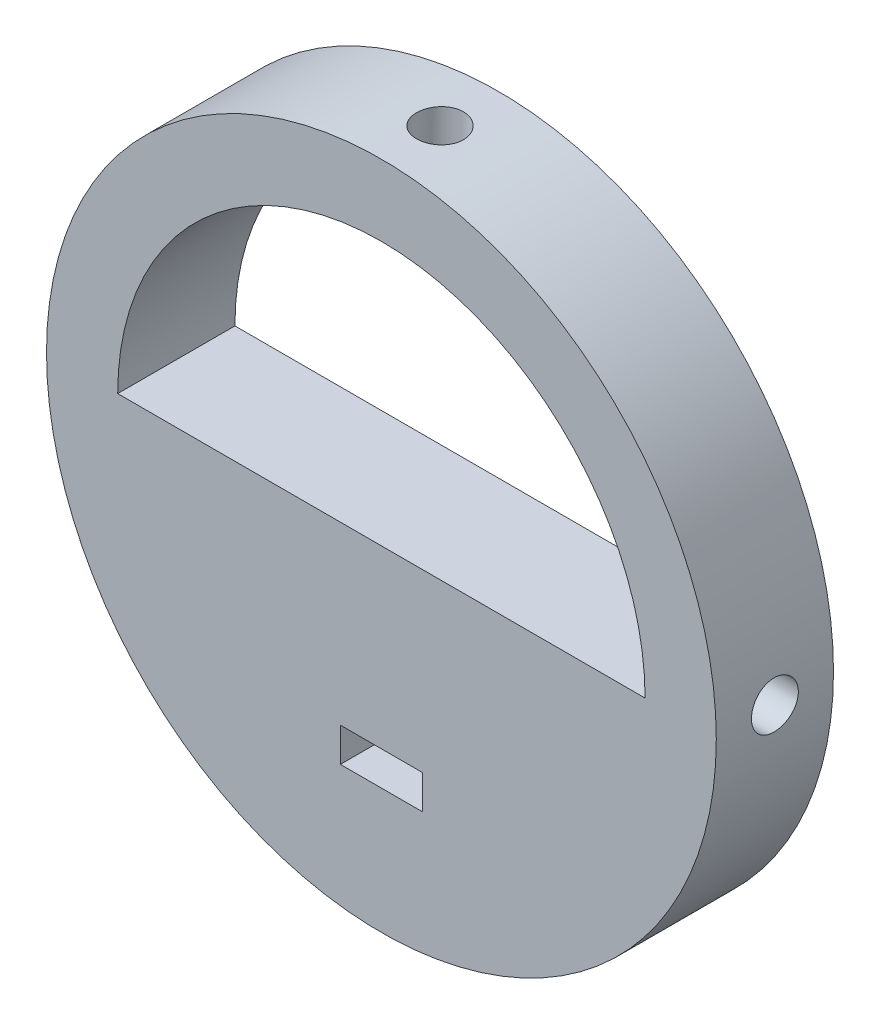
ISO-10303-21;
HEADER;
FILE_DESCRIPTION(('STEP AP214'),'2;1');
FILE_NAME('part.step','',(''),(''),'','','');
FILE_SCHEMA(('AUTOMOTIVE_DESIGN { 1 0 10303 214 1 1 1 1 }'));
ENDSEC;
DATA;
#1=APPLICATION_CONTEXT('core data for automotive mechanical design processes');
#2=APPLICATION_PROTOCOL_DEFINITION('international standard','automotive_design',2000,#1);
#3=PRODUCT_CONTEXT('',#1,'mechanical');
#4=PRODUCT('Part','Part','',(#3));
#5=PRODUCT_RELATED_PRODUCT_CATEGORY('part','',(#4));
#6=PRODUCT_DEFINITION_FORMATION('','',#4);
#7=PRODUCT_DEFINITION_CONTEXT('part definition',#1,'design');
#8=PRODUCT_DEFINITION('design','',#6,#7);
#9=PRODUCT_DEFINITION_SHAPE('','',#8);
#10=(LENGTH_UNIT() NAMED_UNIT(*) SI_UNIT(.MILLI.,.METRE.));
#11=(NAMED_UNIT(*) PLANE_ANGLE_UNIT() SI_UNIT($,.RADIAN.));
#12=(NAMED_UNIT(*) SI_UNIT($,.STERADIAN.) SOLID_ANGLE_UNIT());
#13=UNCERTAINTY_MEASURE_WITH_UNIT(LENGTH_MEASURE(1.E-05),#10,'distance_accuracy_value','');
#14=(GEOMETRIC_REPRESENTATION_CONTEXT(3) GLOBAL_UNCERTAINTY_ASSIGNED_CONTEXT((#13)) GLOBAL_UNIT_ASSIGNED_CONTEXT((#10,
#11,#12)) REPRESENTATION_CONTEXT('',''));
#15=CARTESIAN_POINT('',(0.,0.,0.));
#16=DIRECTION('',(0.,0.,1.));
#17=DIRECTION('',(1.,0.,0.));
#18=AXIS2_PLACEMENT_3D('',#15,#16,#17);
#19=CARTESIAN_POINT('',(3.5,-17.9,-2.02072594216369));
#20=DIRECTION('',(0.5,0.,-0.866025403784439));
#21=DIRECTION('',(-0.866025403784439,0.,-0.5));
#22=AXIS2_PLACEMENT_3D('',#19,#20,#21);
#23=PLANE('',#22);
#24=DIRECTION('',(-0.866025403784438,0.,-0.5));
#25=VECTOR('',#24,1.);
#26=CARTESIAN_POINT('',(3.5,-15.,-2.02072594216369));
#27=LINE('',#26,#25);
#28=CARTESIAN_POINT('',(3.5,-15.,-2.02072594216369));
#29=VERTEX_POINT('',#28);
#30=CARTESIAN_POINT('',(0.,-15.,-4.04145188432738));
#31=VERTEX_POINT('',#30);
#32=EDGE_CURVE('E144',#29,#31,#27,.T.);
#33=ORIENTED_EDGE('',*,*,#32,.T.);
#34=DIRECTION('',(0.,1.,0.));
#35=VECTOR('',#34,1.);
#36=CARTESIAN_POINT('',(0.,-17.9,-4.04145188432738));
#37=LINE('',#36,#35);
#38=CARTESIAN_POINT('',(0.,-17.9,-4.04145188432738));
#39=VERTEX_POINT('',#38);
#40=EDGE_CURVE('E157',#39,#31,#37,.T.);
#41=ORIENTED_EDGE('',*,*,#40,.F.);
#42=DIRECTION('',(-0.866025403784438,0.,-0.5));
#43=VECTOR('',#42,1.);
#44=CARTESIAN_POINT('',(3.5,-17.9,-2.02072594216369));
#45=LINE('',#44,#43);
#46=CARTESIAN_POINT('',(3.5,-17.9,-2.02072594216369));
#47=VERTEX_POINT('',#46);
#48=EDGE_CURVE('E147',#47,#39,#45,.T.);
#49=ORIENTED_EDGE('',*,*,#48,.F.);
#50=DIRECTION('',(0.,1.,0.));
#51=VECTOR('',#50,1.);
#52=CARTESIAN_POINT('',(3.5,-17.9,-2.02072594216369));
#53=LINE('',#52,#51);
#54=EDGE_CURVE('E162',#47,#29,#53,.T.);
#55=ORIENTED_EDGE('',*,*,#54,.T.);
#56=EDGE_LOOP('',(#33,#41,#49,#55));
#57=FACE_BOUND('',#56,.T.);
#58=ADVANCED_FACE('F37',(#57),#23,.F.);
#59=CARTESIAN_POINT('',(3.5,-17.9,2.02072594216369));
#60=DIRECTION('',(1.,0.,0.));
#61=DIRECTION('',(0.,0.,-1.));
#62=AXIS2_PLACEMENT_3D('',#59,#60,#61);
#63=PLANE('',#62);
#64=DIRECTION('',(0.,0.,-1.));
#65=VECTOR('',#64,1.);
#66=CARTESIAN_POINT('',(3.5,-15.,2.02072594216369));
#67=LINE('',#66,#65);
#68=CARTESIAN_POINT('',(3.5,-15.,5.));
#69=VERTEX_POINT('',#68);
#70=EDGE_CURVE('E57',#69,#29,#67,.T.);
#71=ORIENTED_EDGE('',*,*,#70,.T.);
#72=ORIENTED_EDGE('',*,*,#54,.F.);
#73=DIRECTION('',(0.,0.,-1.));
#74=VECTOR('',#73,1.);
#75=CARTESIAN_POINT('',(3.5,-17.9,2.02072594216369));
#76=LINE('',#75,#74);
#77=CARTESIAN_POINT('',(3.5,-17.9,5.));
#78=VERTEX_POINT('',#77);
#79=EDGE_CURVE('E155',#78,#47,#76,.T.);
#80=ORIENTED_EDGE('',*,*,#79,.F.);
#81=DIRECTION('',(0.,1.,0.));
#82=VECTOR('',#81,1.);
#83=CARTESIAN_POINT('',(3.5,-15.,5.));
#84=LINE('',#83,#82);
#85=EDGE_CURVE('E118',#78,#69,#84,.T.);
#86=ORIENTED_EDGE('',*,*,#85,.T.);
#87=EDGE_LOOP('',(#71,#72,#80,#86));
#88=FACE_BOUND('',#87,.T.);
#89=ADVANCED_FACE('F207',(#88),#63,.F.);
#90=CARTESIAN_POINT('',(-3.5,-17.9,-2.02072594216369));
#91=DIRECTION('',(-1.,0.,0.));
#92=DIRECTION('',(0.,0.,1.));
#93=AXIS2_PLACEMENT_3D('',#90,#91,#92);
#94=PLANE('',#93);
#95=DIRECTION('',(0.,-1.,0.));
#96=VECTOR('',#95,1.);
#97=CARTESIAN_POINT('',(-3.5,-15.,5.));
#98=LINE('',#97,#96);
#99=CARTESIAN_POINT('',(-3.5,-15.,5.));
#100=VERTEX_POINT('',#99);
#101=CARTESIAN_POINT('',(-3.5,-17.9,5.));
#102=VERTEX_POINT('',#101);
#103=EDGE_CURVE('E106',#100,#102,#98,.T.);
#104=ORIENTED_EDGE('',*,*,#103,.T.);
#105=DIRECTION('',(0.,0.,1.));
#106=VECTOR('',#105,1.);
#107=CARTESIAN_POINT('',(-3.5,-17.9,-2.02072594216369));
#108=LINE('',#107,#106);
#109=CARTESIAN_POINT('',(-3.5,-17.9,-2.02072594216369));
#110=VERTEX_POINT('',#109);
#111=EDGE_CURVE('E153',#110,#102,#108,.T.);
#112=ORIENTED_EDGE('',*,*,#111,.F.);
#113=DIRECTION('',(0.,1.,0.));
#114=VECTOR('',#113,1.);
#115=CARTESIAN_POINT('',(-3.5,-17.9,-2.02072594216369));
#116=LINE('',#115,#114);
#117=CARTESIAN_POINT('',(-3.5,-15.,-2.02072594216369));
#118=VERTEX_POINT('',#117);
#119=EDGE_CURVE('E108',#110,#118,#116,.T.);
#120=ORIENTED_EDGE('',*,*,#119,.T.);
#121=DIRECTION('',(0.,0.,1.));
#122=VECTOR('',#121,1.);
#123=CARTESIAN_POINT('',(-3.5,-15.,-2.02072594216369));
#124=LINE('',#123,#122);
#125=EDGE_CURVE('E102',#118,#100,#124,.T.);
#126=ORIENTED_EDGE('',*,*,#125,.T.);
#127=EDGE_LOOP('',(#104,#112,#120,#126));
#128=FACE_BOUND('',#127,.T.);
#129=ADVANCED_FACE('F103',(#128),#94,.F.);
#130=CARTESIAN_POINT('',(0.,-17.9,-4.04145188432738));
#131=DIRECTION('',(-0.5,0.,-0.866025403784439));
#132=DIRECTION('',(-0.866025403784439,0.,0.5));
#133=AXIS2_PLACEMENT_3D('',#130,#131,#132);
#134=PLANE('',#133);
#135=DIRECTION('',(-0.866025403784438,0.,0.5));
#136=VECTOR('',#135,1.);
#137=CARTESIAN_POINT('',(0.,-15.,-4.04145188432738));
#138=LINE('',#137,#136);
#139=EDGE_CURVE('E111',#31,#118,#138,.T.);
#140=ORIENTED_EDGE('',*,*,#139,.T.);
#141=ORIENTED_EDGE('',*,*,#119,.F.);
#142=DIRECTION('',(-0.866025403784438,0.,0.5));
#143=VECTOR('',#142,1.);
#144=CARTESIAN_POINT('',(0.,-17.9,-4.04145188432738));
#145=LINE('',#144,#143);
#146=EDGE_CURVE('E150',#39,#110,#145,.T.);
#147=ORIENTED_EDGE('',*,*,#146,.F.);
#148=ORIENTED_EDGE('',*,*,#40,.T.);
#149=EDGE_LOOP('',(#140,#141,#147,#148));
#150=FACE_BOUND('',#149,.T.);
#151=ADVANCED_FACE('F217',(#150),#134,.F.);
#152=CARTESIAN_POINT('',(0.,-17.9,0.));
#153=DIRECTION('',(0.,1.,0.));
#154=DIRECTION('',(0.,0.,1.));
#155=AXIS2_PLACEMENT_3D('',#152,#153,#154);
#156=PLANE('',#155);
#157=CARTESIAN_POINT('',(0.,-17.9,0.));
#158=DIRECTION('',(0.,1.,0.));
#159=DIRECTION('',(0.,0.,1.));
#160=AXIS2_PLACEMENT_3D('',#157,#158,#159);
#161=CIRCLE('',#160,2.);
#162=CARTESIAN_POINT('',(0.,-17.9,2.));
#163=VERTEX_POINT('',#162);
#164=EDGE_CURVE('E434',#163,#163,#161,.T.);
#165=ORIENTED_EDGE('',*,*,#164,.F.);
#166=EDGE_LOOP('',(#165));
#167=FACE_BOUND('',#166,.T.);
#168=DIRECTION('',(1.,0.,0.));
#169=VECTOR('',#168,1.);
#170=CARTESIAN_POINT('',(-3.5,-17.9,5.));
#171=LINE('',#170,#169);
#172=EDGE_CURVE('E123',#102,#78,#171,.T.);
#173=ORIENTED_EDGE('',*,*,#172,.T.);
#174=ORIENTED_EDGE('',*,*,#79,.T.);
#175=ORIENTED_EDGE('',*,*,#48,.T.);
#176=ORIENTED_EDGE('',*,*,#146,.T.);
#177=ORIENTED_EDGE('',*,*,#111,.T.);
#178=EDGE_LOOP('',(#173,#174,#175,#176,#177));
#179=FACE_BOUND('',#178,.T.);
#180=ADVANCED_FACE('F260',(#167,#179),#156,.T.);
#181=CARTESIAN_POINT('',(0.,-15.,0.));
#182=DIRECTION('',(0.,1.,0.));
#183=DIRECTION('',(0.,0.,1.));
#184=AXIS2_PLACEMENT_3D('',#181,#182,#183);
#185=PLANE('',#184);
#186=ORIENTED_EDGE('',*,*,#70,.F.);
#187=DIRECTION('',(-1.,0.,0.));
#188=VECTOR('',#187,1.);
#189=CARTESIAN_POINT('',(-3.5,-15.,5.));
#190=LINE('',#189,#188);
#191=EDGE_CURVE('E114',#69,#100,#190,.T.);
#192=ORIENTED_EDGE('',*,*,#191,.T.);
#193=ORIENTED_EDGE('',*,*,#125,.F.);
#194=ORIENTED_EDGE('',*,*,#139,.F.);
#195=ORIENTED_EDGE('',*,*,#32,.F.);
#196=EDGE_LOOP('',(#186,#192,#193,#194,#195));
#197=FACE_BOUND('',#196,.T.);
#198=ADVANCED_FACE('F115',(#197),#185,.F.);
#199=CARTESIAN_POINT('',(0.,0.,-5.));
#200=DIRECTION('',(0.,0.,1.));
#201=DIRECTION('',(1.,0.,0.));
#202=AXIS2_PLACEMENT_3D('',#199,#200,#201);
#203=CYLINDRICAL_SURFACE('',#202,28.575);
#204=CARTESIAN_POINT('',(0.,-28.575,2.));
#205=CARTESIAN_POINT('',(-0.11219354056318,-28.5749990738678,1.99999507471177));
#206=CARTESIAN_POINT('',(-0.224464926653708,-28.5743321854995,1.99052772333908));
#207=CARTESIAN_POINT('',(-0.445905587141128,-28.5717359509591,1.95289761788403));
#208=CARTESIAN_POINT('',(-0.55507113061016,-28.569805148207,1.92471329315176));
#209=CARTESIAN_POINT('',(-0.767060613861274,-28.5648994336108,1.85046453837661));
#210=CARTESIAN_POINT('',(-0.869887943811847,-28.5619250857343,1.80440976471592));
#211=CARTESIAN_POINT('',(-1.06632644044454,-28.5552664930909,1.69574364018007));
#212=CARTESIAN_POINT('',(-1.15993966570778,-28.5515824074374,1.63313599905981));
#213=CARTESIAN_POINT('',(-1.33549115752078,-28.5439106289807,1.49301579467679));
#214=CARTESIAN_POINT('',(-1.41741017111496,-28.5399224517177,1.41547913457492));
#215=CARTESIAN_POINT('',(-1.56708298415313,-28.5320960917165,1.24775209950961));
#216=CARTESIAN_POINT('',(-1.63483618201317,-28.5282579153541,1.15756118742593));
#217=CARTESIAN_POINT('',(-1.75431592485464,-28.5211605569518,0.966973587270234));
#218=CARTESIAN_POINT('',(-1.80602608287604,-28.5179019683642,0.86656660218511));
#219=CARTESIAN_POINT('',(-1.89184711406326,-28.5123376754792,0.658469075878694));
#220=CARTESIAN_POINT('',(-1.92595821603923,-28.5100319587932,0.550778629372273));
#221=CARTESIAN_POINT('',(-1.97555837686609,-28.5066381321122,0.331359857468293));
#222=CARTESIAN_POINT('',(-1.99107812480204,-28.50554801571,0.219638500951531));
#223=CARTESIAN_POINT('',(-2.00314979096334,-28.5047023203391,-0.00482845246959328));
#224=CARTESIAN_POINT('',(-1.99970197005855,-28.5049467230162,-0.117574035266001));
#225=CARTESIAN_POINT('',(-1.9739617964128,-28.5067406426929,-0.340679507299212));
#226=CARTESIAN_POINT('',(-1.95170269856514,-28.5082878565433,-0.451043254323602));
#227=CARTESIAN_POINT('',(-1.88902343427751,-28.512509426471,-0.666464138270835));
#228=CARTESIAN_POINT('',(-1.84860313651441,-28.5151837906987,-0.771521236815336));
#229=CARTESIAN_POINT('',(-1.75071127246671,-28.5213609483183,-0.973453202932212));
#230=CARTESIAN_POINT('',(-1.6932246748445,-28.5248644714474,-1.07032076043874));
#231=CARTESIAN_POINT('',(-1.56284291542426,-28.5323044371043,-1.25304400808392));
#232=CARTESIAN_POINT('',(-1.48994753497078,-28.5362408857752,-1.33889954193074));
#233=CARTESIAN_POINT('',(-1.3306304004101,-28.5441133534399,-1.49735506013894));
#234=CARTESIAN_POINT('',(-1.24417987653217,-28.5480493532807,-1.5699261223949));
#235=CARTESIAN_POINT('',(-1.06030716399757,-28.5554692728602,-1.6995294102635));
#236=CARTESIAN_POINT('',(-0.962884970522834,-28.5589531924004,-1.75656162905242));
#237=CARTESIAN_POINT('',(-0.759816421663919,-28.5650767767097,-1.85346605967542));
#238=CARTESIAN_POINT('',(-0.654169512785724,-28.5677163845986,-1.89333711544357));
#239=CARTESIAN_POINT('',(-0.437658553002704,-28.5718531926787,-1.95476780448379));
#240=CARTESIAN_POINT('',(-0.326794578505564,-28.5733504095954,-1.97632770584786));
#241=CARTESIAN_POINT('',(-0.103247364094242,-28.5750315797095,-2.0004881037716));
#242=CARTESIAN_POINT('',(0.00943153552587676,-28.5752183018364,-2.00312857522494));
#243=CARTESIAN_POINT('',(0.233630561696571,-28.5742648175843,-1.9894796971824));
#244=CARTESIAN_POINT('',(0.345150695829088,-28.5731246198931,-1.9731904716246));
#245=CARTESIAN_POINT('',(0.563753485923264,-28.5696473918489,-1.92217770100428));
#246=CARTESIAN_POINT('',(0.670840456793627,-28.5673115563252,-1.8874725581378));
#247=CARTESIAN_POINT('',(0.877670453192774,-28.5617057113006,-1.80063182781188));
#248=CARTESIAN_POINT('',(0.977413396102877,-28.5584356912925,-1.74849604429816));
#249=CARTESIAN_POINT('',(1.16690669015187,-28.5513217187838,-1.62817263987901));
#250=CARTESIAN_POINT('',(1.25664009705187,-28.5474768181116,-1.55995839096376));
#251=CARTESIAN_POINT('',(1.42339639101104,-28.5396487395034,-1.40945306968943));
#252=CARTESIAN_POINT('',(1.50041912186126,-28.5356655598688,-1.3271618243552));
#253=CARTESIAN_POINT('',(1.63970364658386,-28.5280017693994,-1.15066565883352));
#254=CARTESIAN_POINT('',(1.70193945657758,-28.5243216984972,-1.05644020643188));
#255=CARTESIAN_POINT('',(1.80970562174227,-28.5176878107967,-0.858853202922395));
#256=CARTESIAN_POINT('',(1.85523610102576,-28.5147339886028,-0.755491719697911));
#257=CARTESIAN_POINT('',(1.92825440331169,-28.5098896365248,-0.542660665084102));
#258=CARTESIAN_POINT('',(1.95575843360493,-28.5079981517297,-0.433196676722416));
#259=CARTESIAN_POINT('',(1.99199597890018,-28.5054891571507,-0.211190705646622));
#260=CARTESIAN_POINT('',(2.0007297368058,-28.5048716308807,-0.0986487627830022));
#261=CARTESIAN_POINT('',(1.99917634609933,-28.5049805995046,0.1260601712499));
#262=CARTESIAN_POINT('',(1.98893003786454,-28.505704208611,0.23822744842165));
#263=CARTESIAN_POINT('',(1.9497922053696,-28.508407791037,0.459244479797018));
#264=CARTESIAN_POINT('',(1.92090064884107,-28.510387766531,0.568094228258817));
#265=CARTESIAN_POINT('',(1.84530205889283,-28.51538024377,0.779391268602113));
#266=CARTESIAN_POINT('',(1.7985953992152,-28.518392723854,0.881838694745112));
#267=CARTESIAN_POINT('',(1.68869757667519,-28.5251107425481,1.07744375051576));
#268=CARTESIAN_POINT('',(1.62550678553827,-28.5288162655292,1.17060158956279));
#269=CARTESIAN_POINT('',(1.48428213639591,-28.5365121995252,1.3451911115595));
#270=CARTESIAN_POINT('',(1.40621841243273,-28.5405031734989,1.42659861072129));
#271=CARTESIAN_POINT('',(1.23751051752041,-28.548315323101,1.57518375060026));
#272=CARTESIAN_POINT('',(1.146863284661,-28.5521364571029,1.64235791787943));
#273=CARTESIAN_POINT('',(0.955435284152127,-28.5591832678739,1.76063205695427));
#274=CARTESIAN_POINT('',(0.854640132542886,-28.562408080512,1.81170877617092));
#275=CARTESIAN_POINT('',(0.645953906162349,-28.5678878896534,1.89615011812312));
#276=CARTESIAN_POINT('',(0.538071257205631,-28.5701440145379,1.92953535955315));
#277=CARTESIAN_POINT('',(0.35794675923725,-28.572844932738,1.96902579224818));
#278=CARTESIAN_POINT('',(0.286867397038429,-28.5736494629358,1.98062596470359));
#279=CARTESIAN_POINT('',(0.143869360917317,-28.5747272930627,1.99611464103698));
#280=CARTESIAN_POINT('',(0.0719506884879489,-28.5750005939366,2.00000315862997));
#281=CARTESIAN_POINT('',(0.,-28.575,2.));
#282=B_SPLINE_CURVE_WITH_KNOTS('',3,(#204,#205,#206,#207,#208,#209,#210,#211,#212,#213,#214,
#215,#216,#217,#218,#219,#220,#221,#222,#223,#224,#225,#226,#227,#228,#229,#230,#231,#232,#233,
#234,#235,#236,#237,#238,#239,#240,#241,#242,#243,#244,#245,#246,#247,#248,#249,#250,#251,#252,
#253,#254,#255,#256,#257,#258,#259,#260,#261,#262,#263,#264,#265,#266,#267,#268,#269,#270,#271,
#272,#273,#274,#275,#276,#277,#278,#279,#280,#281),.UNSPECIFIED.,.T.,.F.,(4,2,2,2,2,2,2,2,2,2,2,
2,2,2,2,2,2,2,2,2,2,2,2,2,2,2,2,2,2,2,2,2,2,2,2,2,2,2,4),(0.,0.33631794742387,0.673024163584345,
1.00954869173589,1.34599786334729,1.68299471837176,2.02000588183758,2.35736015629975,
2.69471004461592,3.03150229259587,3.36828990852595,3.70448338804781,4.04067929861466,
4.37717220050721,4.71366987765957,5.05089166217611,5.38811359478008,5.7253582408675,
6.06259794930031,6.39912489272344,6.73564963282176,7.07183873041285,7.40803160947879,
7.74478522859199,8.08154298595974,8.41888819532997,8.75623089833798,9.09326988435508,
9.43030450876921,9.76661476084941,10.1029255949662,10.4392293740243,10.7755255699183,
11.1125043303135,11.4495652310117,11.7871108041551,12.1242621116766,12.3399461054502,
12.5556297156343),.UNSPECIFIED.);
#283=CARTESIAN_POINT('',(0.,-28.575,2.));
#284=VERTEX_POINT('',#283);
#285=EDGE_CURVE('E11',#284,#284,#282,.T.);
#286=ORIENTED_EDGE('',*,*,#285,.F.);
#287=EDGE_LOOP('',(#286));
#288=FACE_BOUND('',#287,.T.);
#289=CARTESIAN_POINT('',(28.575,0.,-2.));
#290=CARTESIAN_POINT('',(28.5749990738678,0.11219354056318,-1.99999507471177));
#291=CARTESIAN_POINT('',(28.5743321854995,0.224464926653708,-1.99052772333908));
#292=CARTESIAN_POINT('',(28.5717359509591,0.445905587141128,-1.95289761788403));
#293=CARTESIAN_POINT('',(28.569805148207,0.55507113061016,-1.92471329315176));
#294=CARTESIAN_POINT('',(28.5648994336108,0.767060613861274,-1.85046453837661));
#295=CARTESIAN_POINT('',(28.5619250857343,0.869887943811847,-1.80440976471592));
#296=CARTESIAN_POINT('',(28.5552664930909,1.06632644044454,-1.69574364018007));
#297=CARTESIAN_POINT('',(28.5515824074374,1.15993966570778,-1.63313599905981));
#298=CARTESIAN_POINT('',(28.5439106289807,1.33549115752078,-1.49301579467679));
#299=CARTESIAN_POINT('',(28.5399224517177,1.41741017111496,-1.41547913457492));
#300=CARTESIAN_POINT('',(28.5320960917165,1.56708298415313,-1.24775209950961));
#301=CARTESIAN_POINT('',(28.5282579153541,1.63483618201317,-1.15756118742593));
#302=CARTESIAN_POINT('',(28.5211605569518,1.75431592485464,-0.966973587270234));
#303=CARTESIAN_POINT('',(28.5179019683642,1.80602608287604,-0.86656660218511));
#304=CARTESIAN_POINT('',(28.5123376754792,1.89184711406326,-0.658469075878694));
#305=CARTESIAN_POINT('',(28.5100319587932,1.92595821603923,-0.550778629372273));
#306=CARTESIAN_POINT('',(28.5066381321122,1.97555837686609,-0.331359857468293));
#307=CARTESIAN_POINT('',(28.50554801571,1.99107812480204,-0.219638500951531));
#308=CARTESIAN_POINT('',(28.5047023203391,2.00314979096334,0.00482845246959328));
#309=CARTESIAN_POINT('',(28.5049467230162,1.99970197005855,0.117574035266001));
#310=CARTESIAN_POINT('',(28.5067406426929,1.9739617964128,0.340679507299212));
#311=CARTESIAN_POINT('',(28.5082878565433,1.95170269856514,0.451043254323602));
#312=CARTESIAN_POINT('',(28.512509426471,1.88902343427751,0.666464138270835));
#313=CARTESIAN_POINT('',(28.5151837906987,1.84860313651441,0.771521236815336));
#314=CARTESIAN_POINT('',(28.5213609483183,1.75071127246671,0.973453202932212));
#315=CARTESIAN_POINT('',(28.5248644714474,1.6932246748445,1.07032076043874));
#316=CARTESIAN_POINT('',(28.5323044371043,1.56284291542426,1.25304400808392));
#317=CARTESIAN_POINT('',(28.5362408857752,1.48994753497078,1.33889954193074));
#318=CARTESIAN_POINT('',(28.5441133534399,1.3306304004101,1.49735506013894));
#319=CARTESIAN_POINT('',(28.5480493532807,1.24417987653217,1.5699261223949));
#320=CARTESIAN_POINT('',(28.5554692728602,1.06030716399757,1.6995294102635));
#321=CARTESIAN_POINT('',(28.5589531924004,0.962884970522834,1.75656162905242));
#322=CARTESIAN_POINT('',(28.5650767767097,0.759816421663919,1.85346605967542));
#323=CARTESIAN_POINT('',(28.5677163845986,0.654169512785724,1.89333711544357));
#324=CARTESIAN_POINT('',(28.5718531926787,0.437658553002704,1.95476780448379));
#325=CARTESIAN_POINT('',(28.5733504095954,0.326794578505564,1.97632770584786));
#326=CARTESIAN_POINT('',(28.5750315797095,0.103247364094242,2.0004881037716));
#327=CARTESIAN_POINT('',(28.5752183018364,-0.00943153552587676,2.00312857522494));
#328=CARTESIAN_POINT('',(28.5742648175843,-0.233630561696571,1.9894796971824));
#329=CARTESIAN_POINT('',(28.5731246198931,-0.345150695829088,1.9731904716246));
#330=CARTESIAN_POINT('',(28.5696473918489,-0.563753485923264,1.92217770100428));
#331=CARTESIAN_POINT('',(28.5673115563252,-0.670840456793627,1.8874725581378));
#332=CARTESIAN_POINT('',(28.5617057113006,-0.877670453192774,1.80063182781188));
#333=CARTESIAN_POINT('',(28.5584356912925,-0.977413396102877,1.74849604429816));
#334=CARTESIAN_POINT('',(28.5513217187838,-1.16690669015187,1.62817263987901));
#335=CARTESIAN_POINT('',(28.5474768181116,-1.25664009705187,1.55995839096376));
#336=CARTESIAN_POINT('',(28.5396487395034,-1.42339639101104,1.40945306968943));
#337=CARTESIAN_POINT('',(28.5356655598688,-1.50041912186126,1.3271618243552));
#338=CARTESIAN_POINT('',(28.5280017693994,-1.63970364658386,1.15066565883352));
#339=CARTESIAN_POINT('',(28.5243216984972,-1.70193945657758,1.05644020643188));
#340=CARTESIAN_POINT('',(28.5176878107967,-1.80970562174227,0.858853202922395));
#341=CARTESIAN_POINT('',(28.5147339886028,-1.85523610102576,0.755491719697911));
#342=CARTESIAN_POINT('',(28.5098896365248,-1.92825440331169,0.542660665084102));
#343=CARTESIAN_POINT('',(28.5079981517297,-1.95575843360493,0.433196676722416));
#344=CARTESIAN_POINT('',(28.5054891571507,-1.99199597890018,0.211190705646622));
#345=CARTESIAN_POINT('',(28.5048716308807,-2.0007297368058,0.0986487627830022));
#346=CARTESIAN_POINT('',(28.5049805995046,-1.99917634609933,-0.1260601712499));
#347=CARTESIAN_POINT('',(28.505704208611,-1.98893003786454,-0.23822744842165));
#348=CARTESIAN_POINT('',(28.508407791037,-1.9497922053696,-0.459244479797018));
#349=CARTESIAN_POINT('',(28.510387766531,-1.92090064884107,-0.568094228258817));
#350=CARTESIAN_POINT('',(28.51538024377,-1.84530205889283,-0.779391268602113));
#351=CARTESIAN_POINT('',(28.518392723854,-1.7985953992152,-0.881838694745112));
#352=CARTESIAN_POINT('',(28.5251107425481,-1.68869757667519,-1.07744375051576));
#353=CARTESIAN_POINT('',(28.5288162655292,-1.62550678553827,-1.17060158956279));
#354=CARTESIAN_POINT('',(28.5365121995252,-1.48428213639591,-1.3451911115595));
#355=CARTESIAN_POINT('',(28.5405031734989,-1.40621841243273,-1.42659861072129));
#356=CARTESIAN_POINT('',(28.548315323101,-1.23751051752041,-1.57518375060026));
#357=CARTESIAN_POINT('',(28.5521364571029,-1.146863284661,-1.64235791787943));
#358=CARTESIAN_POINT('',(28.5591832678739,-0.955435284152127,-1.76063205695427));
#359=CARTESIAN_POINT('',(28.562408080512,-0.854640132542886,-1.81170877617092));
#360=CARTESIAN_POINT('',(28.5678878896534,-0.645953906162349,-1.89615011812312));
#361=CARTESIAN_POINT('',(28.5701440145379,-0.538071257205631,-1.92953535955315));
#362=CARTESIAN_POINT('',(28.572844932738,-0.35794675923725,-1.96902579224818));
#363=CARTESIAN_POINT('',(28.5736494629358,-0.286867397038429,-1.98062596470359));
#364=CARTESIAN_POINT('',(28.5747272930627,-0.143869360917317,-1.99611464103698));
#365=CARTESIAN_POINT('',(28.5750005939366,-0.0719506884879489,-2.00000315862997));
#366=CARTESIAN_POINT('',(28.575,0.,-2.));
#367=B_SPLINE_CURVE_WITH_KNOTS('',3,(#289,#290,#291,#292,#293,#294,#295,#296,#297,#298,#299,
#300,#301,#302,#303,#304,#305,#306,#307,#308,#309,#310,#311,#312,#313,#314,#315,#316,#317,#318,
#319,#320,#321,#322,#323,#324,#325,#326,#327,#328,#329,#330,#331,#332,#333,#334,#335,#336,#337,
#338,#339,#340,#341,#342,#343,#344,#345,#346,#347,#348,#349,#350,#351,#352,#353,#354,#355,#356,
#357,#358,#359,#360,#361,#362,#363,#364,#365,#366),.UNSPECIFIED.,.T.,.F.,(4,2,2,2,2,2,2,2,2,2,2,
2,2,2,2,2,2,2,2,2,2,2,2,2,2,2,2,2,2,2,2,2,2,2,2,2,2,2,4),(0.,0.33631794742387,0.673024163584345,
1.00954869173589,1.34599786334729,1.68299471837176,2.02000588183758,2.35736015629975,
2.69471004461592,3.03150229259587,3.36828990852595,3.70448338804781,4.04067929861466,
4.37717220050721,4.71366987765957,5.05089166217611,5.38811359478008,5.7253582408675,
6.06259794930031,6.39912489272344,6.73564963282176,7.07183873041285,7.40803160947879,
7.74478522859199,8.08154298595974,8.41888819532997,8.75623089833798,9.09326988435508,
9.43030450876921,9.76661476084941,10.1029255949662,10.4392293740243,10.7755255699183,
11.1125043303135,11.4495652310117,11.7871108041551,12.1242621116766,12.3399461054502,
12.5556297156343),.UNSPECIFIED.);
#368=CARTESIAN_POINT('',(28.575,0.,-2.));
#369=VERTEX_POINT('',#368);
#370=EDGE_CURVE('E131',#369,#369,#367,.T.);
#371=ORIENTED_EDGE('',*,*,#370,.F.);
#372=EDGE_LOOP('',(#371));
#373=FACE_BOUND('',#372,.T.);
#374=CARTESIAN_POINT('',(0.,0.,5.));
#375=DIRECTION('',(0.,0.,1.));
#376=DIRECTION('',(1.,0.,0.));
#377=AXIS2_PLACEMENT_3D('',#374,#375,#376);
#378=CIRCLE('',#377,28.575);
#379=CARTESIAN_POINT('',(28.575,0.,5.));
#380=VERTEX_POINT('',#379);
#381=EDGE_CURVE('E175',#380,#380,#378,.T.);
#382=ORIENTED_EDGE('',*,*,#381,.F.);
#383=EDGE_LOOP('',(#382));
#384=FACE_BOUND('',#383,.T.);
#385=CARTESIAN_POINT('',(0.,0.,-5.));
#386=DIRECTION('',(0.,0.,1.));
#387=DIRECTION('',(1.,0.,0.));
#388=AXIS2_PLACEMENT_3D('',#385,#386,#387);
#389=CIRCLE('',#388,28.575);
#390=CARTESIAN_POINT('',(28.575,0.,-5.));
#391=VERTEX_POINT('',#390);
#392=EDGE_CURVE('E50',#391,#391,#389,.T.);
#393=ORIENTED_EDGE('',*,*,#392,.T.);
#394=EDGE_LOOP('',(#393));
#395=FACE_BOUND('',#394,.T.);
#396=CARTESIAN_POINT('',(0.,28.575,2.));
#397=CARTESIAN_POINT('',(0.11219354056318,28.5749990738678,1.99999507471177));
#398=CARTESIAN_POINT('',(0.224464926653708,28.5743321854995,1.99052772333908));
#399=CARTESIAN_POINT('',(0.445905587141128,28.5717359509591,1.95289761788403));
#400=CARTESIAN_POINT('',(0.55507113061016,28.569805148207,1.92471329315176));
#401=CARTESIAN_POINT('',(0.767060613861274,28.5648994336108,1.85046453837661));
#402=CARTESIAN_POINT('',(0.869887943811847,28.5619250857343,1.80440976471592));
#403=CARTESIAN_POINT('',(1.06632644044454,28.5552664930909,1.69574364018007));
#404=CARTESIAN_POINT('',(1.15993966570778,28.5515824074374,1.63313599905981));
#405=CARTESIAN_POINT('',(1.33549115752078,28.5439106289807,1.49301579467679));
#406=CARTESIAN_POINT('',(1.41741017111496,28.5399224517177,1.41547913457492));
#407=CARTESIAN_POINT('',(1.56708298415313,28.5320960917165,1.24775209950961));
#408=CARTESIAN_POINT('',(1.63483618201317,28.5282579153541,1.15756118742593));
#409=CARTESIAN_POINT('',(1.75431592485464,28.5211605569518,0.966973587270234));
#410=CARTESIAN_POINT('',(1.80602608287604,28.5179019683642,0.86656660218511));
#411=CARTESIAN_POINT('',(1.89184711406326,28.5123376754792,0.658469075878694));
#412=CARTESIAN_POINT('',(1.92595821603923,28.5100319587932,0.550778629372273));
#413=CARTESIAN_POINT('',(1.97555837686609,28.5066381321122,0.331359857468293));
#414=CARTESIAN_POINT('',(1.99107812480204,28.50554801571,0.219638500951531));
#415=CARTESIAN_POINT('',(2.00314979096334,28.5047023203391,-0.00482845246959328));
#416=CARTESIAN_POINT('',(1.99970197005855,28.5049467230162,-0.117574035266001));
#417=CARTESIAN_POINT('',(1.9739617964128,28.5067406426929,-0.340679507299212));
#418=CARTESIAN_POINT('',(1.95170269856514,28.5082878565433,-0.451043254323602));
#419=CARTESIAN_POINT('',(1.88902343427751,28.512509426471,-0.666464138270835));
#420=CARTESIAN_POINT('',(1.84860313651441,28.5151837906987,-0.771521236815336));
#421=CARTESIAN_POINT('',(1.75071127246671,28.5213609483183,-0.973453202932212));
#422=CARTESIAN_POINT('',(1.6932246748445,28.5248644714474,-1.07032076043874));
#423=CARTESIAN_POINT('',(1.56284291542426,28.5323044371043,-1.25304400808392));
#424=CARTESIAN_POINT('',(1.48994753497078,28.5362408857752,-1.33889954193074));
#425=CARTESIAN_POINT('',(1.3306304004101,28.5441133534399,-1.49735506013894));
#426=CARTESIAN_POINT('',(1.24417987653217,28.5480493532807,-1.5699261223949));
#427=CARTESIAN_POINT('',(1.06030716399757,28.5554692728602,-1.6995294102635));
#428=CARTESIAN_POINT('',(0.962884970522834,28.5589531924004,-1.75656162905242));
#429=CARTESIAN_POINT('',(0.759816421663919,28.5650767767097,-1.85346605967542));
#430=CARTESIAN_POINT('',(0.654169512785724,28.5677163845986,-1.89333711544357));
#431=CARTESIAN_POINT('',(0.437658553002704,28.5718531926787,-1.95476780448379));
#432=CARTESIAN_POINT('',(0.326794578505564,28.5733504095954,-1.97632770584786));
#433=CARTESIAN_POINT('',(0.103247364094242,28.5750315797095,-2.0004881037716));
#434=CARTESIAN_POINT('',(-0.00943153552587676,28.5752183018364,-2.00312857522494));
#435=CARTESIAN_POINT('',(-0.233630561696571,28.5742648175843,-1.9894796971824));
#436=CARTESIAN_POINT('',(-0.345150695829088,28.5731246198931,-1.9731904716246));
#437=CARTESIAN_POINT('',(-0.563753485923264,28.5696473918489,-1.92217770100428));
#438=CARTESIAN_POINT('',(-0.670840456793627,28.5673115563252,-1.8874725581378));
#439=CARTESIAN_POINT('',(-0.877670453192774,28.5617057113006,-1.80063182781188));
#440=CARTESIAN_POINT('',(-0.977413396102877,28.5584356912925,-1.74849604429816));
#441=CARTESIAN_POINT('',(-1.16690669015187,28.5513217187838,-1.62817263987901));
#442=CARTESIAN_POINT('',(-1.25664009705187,28.5474768181116,-1.55995839096376));
#443=CARTESIAN_POINT('',(-1.42339639101104,28.5396487395034,-1.40945306968943));
#444=CARTESIAN_POINT('',(-1.50041912186126,28.5356655598688,-1.3271618243552));
#445=CARTESIAN_POINT('',(-1.63970364658386,28.5280017693994,-1.15066565883352));
#446=CARTESIAN_POINT('',(-1.70193945657758,28.5243216984972,-1.05644020643188));
#447=CARTESIAN_POINT('',(-1.80970562174227,28.5176878107967,-0.858853202922395));
#448=CARTESIAN_POINT('',(-1.85523610102576,28.5147339886028,-0.755491719697911));
#449=CARTESIAN_POINT('',(-1.92825440331169,28.5098896365248,-0.542660665084102));
#450=CARTESIAN_POINT('',(-1.95575843360493,28.5079981517297,-0.433196676722416));
#451=CARTESIAN_POINT('',(-1.99199597890018,28.5054891571507,-0.211190705646622));
#452=CARTESIAN_POINT('',(-2.0007297368058,28.5048716308807,-0.0986487627830022));
#453=CARTESIAN_POINT('',(-1.99917634609933,28.5049805995046,0.1260601712499));
#454=CARTESIAN_POINT('',(-1.98893003786454,28.505704208611,0.23822744842165));
#455=CARTESIAN_POINT('',(-1.9497922053696,28.508407791037,0.459244479797018));
#456=CARTESIAN_POINT('',(-1.92090064884107,28.510387766531,0.568094228258817));
#457=CARTESIAN_POINT('',(-1.84530205889283,28.51538024377,0.779391268602113));
#458=CARTESIAN_POINT('',(-1.7985953992152,28.518392723854,0.881838694745112));
#459=CARTESIAN_POINT('',(-1.68869757667519,28.5251107425481,1.07744375051576));
#460=CARTESIAN_POINT('',(-1.62550678553827,28.5288162655292,1.17060158956279));
#461=CARTESIAN_POINT('',(-1.48428213639591,28.5365121995252,1.3451911115595));
#462=CARTESIAN_POINT('',(-1.40621841243273,28.5405031734989,1.42659861072129));
#463=CARTESIAN_POINT('',(-1.23751051752041,28.548315323101,1.57518375060026));
#464=CARTESIAN_POINT('',(-1.146863284661,28.5521364571029,1.64235791787943));
#465=CARTESIAN_POINT('',(-0.955435284152127,28.5591832678739,1.76063205695427));
#466=CARTESIAN_POINT('',(-0.854640132542886,28.562408080512,1.81170877617092));
#467=CARTESIAN_POINT('',(-0.645953906162349,28.5678878896534,1.89615011812312));
#468=CARTESIAN_POINT('',(-0.538071257205631,28.5701440145379,1.92953535955315));
#469=CARTESIAN_POINT('',(-0.35794675923725,28.572844932738,1.96902579224818));
#470=CARTESIAN_POINT('',(-0.286867397038429,28.5736494629358,1.98062596470359));
#471=CARTESIAN_POINT('',(-0.143869360917317,28.5747272930627,1.99611464103698));
#472=CARTESIAN_POINT('',(-0.0719506884879489,28.5750005939366,2.00000315862997));
#473=CARTESIAN_POINT('',(0.,28.575,2.));
#474=B_SPLINE_CURVE_WITH_KNOTS('',3,(#396,#397,#398,#399,#400,#401,#402,#403,#404,#405,#406,
#407,#408,#409,#410,#411,#412,#413,#414,#415,#416,#417,#418,#419,#420,#421,#422,#423,#424,#425,
#426,#427,#428,#429,#430,#431,#432,#433,#434,#435,#436,#437,#438,#439,#440,#441,#442,#443,#444,
#445,#446,#447,#448,#449,#450,#451,#452,#453,#454,#455,#456,#457,#458,#459,#460,#461,#462,#463,
#464,#465,#466,#467,#468,#469,#470,#471,#472,#473),.UNSPECIFIED.,.T.,.F.,(4,2,2,2,2,2,2,2,2,2,2,
2,2,2,2,2,2,2,2,2,2,2,2,2,2,2,2,2,2,2,2,2,2,2,2,2,2,2,4),(0.,0.33631794742387,0.673024163584345,
1.00954869173589,1.34599786334729,1.68299471837176,2.02000588183758,2.35736015629975,
2.69471004461592,3.03150229259587,3.36828990852595,3.70448338804781,4.04067929861466,
4.37717220050721,4.71366987765957,5.05089166217611,5.38811359478008,5.7253582408675,
6.06259794930031,6.39912489272344,6.73564963282176,7.07183873041285,7.40803160947879,
7.74478522859199,8.08154298595974,8.41888819532997,8.75623089833798,9.09326988435508,
9.43030450876921,9.76661476084941,10.1029255949662,10.4392293740243,10.7755255699183,
11.1125043303135,11.4495652310117,11.7871108041551,12.1242621116766,12.3399461054502,
12.5556297156343),.UNSPECIFIED.);
#475=CARTESIAN_POINT('',(0.,28.575,2.));
#476=VERTEX_POINT('',#475);
#477=EDGE_CURVE('E174',#476,#476,#474,.T.);
#478=ORIENTED_EDGE('',*,*,#477,.F.);
#479=EDGE_LOOP('',(#478));
#480=FACE_BOUND('',#479,.T.);
#481=CARTESIAN_POINT('',(-28.575,0.,2.));
#482=CARTESIAN_POINT('',(-28.5749990738678,-0.11219354056318,1.99999507471177));
#483=CARTESIAN_POINT('',(-28.5743321854995,-0.224464926653708,1.99052772333908));
#484=CARTESIAN_POINT('',(-28.5717359509591,-0.445905587141128,1.95289761788403));
#485=CARTESIAN_POINT('',(-28.569805148207,-0.55507113061016,1.92471329315176));
#486=CARTESIAN_POINT('',(-28.5648994336108,-0.767060613861274,1.85046453837661));
#487=CARTESIAN_POINT('',(-28.5619250857343,-0.869887943811847,1.80440976471592));
#488=CARTESIAN_POINT('',(-28.5552664930909,-1.06632644044454,1.69574364018007));
#489=CARTESIAN_POINT('',(-28.5515824074374,-1.15993966570778,1.63313599905981));
#490=CARTESIAN_POINT('',(-28.5439106289807,-1.33549115752078,1.49301579467679));
#491=CARTESIAN_POINT('',(-28.5399224517177,-1.41741017111496,1.41547913457492));
#492=CARTESIAN_POINT('',(-28.5320960917165,-1.56708298415313,1.24775209950961));
#493=CARTESIAN_POINT('',(-28.5282579153541,-1.63483618201317,1.15756118742593));
#494=CARTESIAN_POINT('',(-28.5211605569518,-1.75431592485464,0.966973587270234));
#495=CARTESIAN_POINT('',(-28.5179019683642,-1.80602608287604,0.86656660218511));
#496=CARTESIAN_POINT('',(-28.5123376754792,-1.89184711406326,0.658469075878694));
#497=CARTESIAN_POINT('',(-28.5100319587932,-1.92595821603923,0.550778629372273));
#498=CARTESIAN_POINT('',(-28.5066381321122,-1.97555837686609,0.331359857468293));
#499=CARTESIAN_POINT('',(-28.50554801571,-1.99107812480204,0.219638500951531));
#500=CARTESIAN_POINT('',(-28.5047023203391,-2.00314979096334,-0.00482845246959328));
#501=CARTESIAN_POINT('',(-28.5049467230162,-1.99970197005855,-0.117574035266001));
#502=CARTESIAN_POINT('',(-28.5067406426929,-1.9739617964128,-0.340679507299212));
#503=CARTESIAN_POINT('',(-28.5082878565433,-1.95170269856514,-0.451043254323602));
#504=CARTESIAN_POINT('',(-28.512509426471,-1.88902343427751,-0.666464138270835));
#505=CARTESIAN_POINT('',(-28.5151837906987,-1.84860313651441,-0.771521236815336));
#506=CARTESIAN_POINT('',(-28.5213609483183,-1.75071127246671,-0.973453202932212));
#507=CARTESIAN_POINT('',(-28.5248644714474,-1.6932246748445,-1.07032076043874));
#508=CARTESIAN_POINT('',(-28.5323044371043,-1.56284291542426,-1.25304400808392));
#509=CARTESIAN_POINT('',(-28.5362408857752,-1.48994753497078,-1.33889954193074));
#510=CARTESIAN_POINT('',(-28.5441133534399,-1.3306304004101,-1.49735506013894));
#511=CARTESIAN_POINT('',(-28.5480493532807,-1.24417987653217,-1.5699261223949));
#512=CARTESIAN_POINT('',(-28.5554692728602,-1.06030716399757,-1.6995294102635));
#513=CARTESIAN_POINT('',(-28.5589531924004,-0.962884970522834,-1.75656162905242));
#514=CARTESIAN_POINT('',(-28.5650767767097,-0.759816421663919,-1.85346605967542));
#515=CARTESIAN_POINT('',(-28.5677163845986,-0.654169512785724,-1.89333711544357));
#516=CARTESIAN_POINT('',(-28.5718531926787,-0.437658553002704,-1.95476780448379));
#517=CARTESIAN_POINT('',(-28.5733504095954,-0.326794578505564,-1.97632770584786));
#518=CARTESIAN_POINT('',(-28.5750315797095,-0.103247364094242,-2.0004881037716));
#519=CARTESIAN_POINT('',(-28.5752183018364,0.00943153552587676,-2.00312857522494));
#520=CARTESIAN_POINT('',(-28.5742648175843,0.233630561696571,-1.9894796971824));
#521=CARTESIAN_POINT('',(-28.5731246198931,0.345150695829088,-1.9731904716246));
#522=CARTESIAN_POINT('',(-28.5696473918489,0.563753485923264,-1.92217770100428));
#523=CARTESIAN_POINT('',(-28.5673115563252,0.670840456793627,-1.8874725581378));
#524=CARTESIAN_POINT('',(-28.5617057113006,0.877670453192774,-1.80063182781188));
#525=CARTESIAN_POINT('',(-28.5584356912925,0.977413396102877,-1.74849604429816));
#526=CARTESIAN_POINT('',(-28.5513217187838,1.16690669015187,-1.62817263987901));
#527=CARTESIAN_POINT('',(-28.5474768181116,1.25664009705187,-1.55995839096376));
#528=CARTESIAN_POINT('',(-28.5396487395034,1.42339639101104,-1.40945306968943));
#529=CARTESIAN_POINT('',(-28.5356655598688,1.50041912186126,-1.3271618243552));
#530=CARTESIAN_POINT('',(-28.5280017693994,1.63970364658386,-1.15066565883352));
#531=CARTESIAN_POINT('',(-28.5243216984972,1.70193945657758,-1.05644020643188));
#532=CARTESIAN_POINT('',(-28.5176878107967,1.80970562174227,-0.858853202922395));
#533=CARTESIAN_POINT('',(-28.5147339886028,1.85523610102576,-0.755491719697911));
#534=CARTESIAN_POINT('',(-28.5098896365248,1.92825440331169,-0.542660665084102));
#535=CARTESIAN_POINT('',(-28.5079981517297,1.95575843360493,-0.433196676722416));
#536=CARTESIAN_POINT('',(-28.5054891571507,1.99199597890018,-0.211190705646622));
#537=CARTESIAN_POINT('',(-28.5048716308807,2.0007297368058,-0.0986487627830022));
#538=CARTESIAN_POINT('',(-28.5049805995046,1.99917634609933,0.1260601712499));
#539=CARTESIAN_POINT('',(-28.505704208611,1.98893003786454,0.23822744842165));
#540=CARTESIAN_POINT('',(-28.508407791037,1.9497922053696,0.459244479797018));
#541=CARTESIAN_POINT('',(-28.510387766531,1.92090064884107,0.568094228258817));
#542=CARTESIAN_POINT('',(-28.51538024377,1.84530205889283,0.779391268602113));
#543=CARTESIAN_POINT('',(-28.518392723854,1.7985953992152,0.881838694745112));
#544=CARTESIAN_POINT('',(-28.5251107425481,1.68869757667519,1.07744375051576));
#545=CARTESIAN_POINT('',(-28.5288162655292,1.62550678553827,1.17060158956279));
#546=CARTESIAN_POINT('',(-28.5365121995252,1.48428213639591,1.3451911115595));
#547=CARTESIAN_POINT('',(-28.5405031734989,1.40621841243273,1.42659861072129));
#548=CARTESIAN_POINT('',(-28.548315323101,1.23751051752041,1.57518375060026));
#549=CARTESIAN_POINT('',(-28.5521364571029,1.146863284661,1.64235791787943));
#550=CARTESIAN_POINT('',(-28.5591832678739,0.955435284152127,1.76063205695427));
#551=CARTESIAN_POINT('',(-28.562408080512,0.854640132542886,1.81170877617092));
#552=CARTESIAN_POINT('',(-28.5678878896534,0.645953906162349,1.89615011812312));
#553=CARTESIAN_POINT('',(-28.5701440145379,0.538071257205631,1.92953535955315));
#554=CARTESIAN_POINT('',(-28.572844932738,0.35794675923725,1.96902579224818));
#555=CARTESIAN_POINT('',(-28.5736494629358,0.286867397038429,1.98062596470359));
#556=CARTESIAN_POINT('',(-28.5747272930627,0.143869360917317,1.99611464103698));
#557=CARTESIAN_POINT('',(-28.5750005939366,0.0719506884879489,2.00000315862997));
#558=CARTESIAN_POINT('',(-28.575,0.,2.));
#559=B_SPLINE_CURVE_WITH_KNOTS('',3,(#481,#482,#483,#484,#485,#486,#487,#488,#489,#490,#491,
#492,#493,#494,#495,#496,#497,#498,#499,#500,#501,#502,#503,#504,#505,#506,#507,#508,#509,#510,
#511,#512,#513,#514,#515,#516,#517,#518,#519,#520,#521,#522,#523,#524,#525,#526,#527,#528,#529,
#530,#531,#532,#533,#534,#535,#536,#537,#538,#539,#540,#541,#542,#543,#544,#545,#546,#547,#548,
#549,#550,#551,#552,#553,#554,#555,#556,#557,#558),.UNSPECIFIED.,.T.,.F.,(4,2,2,2,2,2,2,2,2,2,2,
2,2,2,2,2,2,2,2,2,2,2,2,2,2,2,2,2,2,2,2,2,2,2,2,2,2,2,4),(0.,0.33631794742387,0.673024163584345,
1.00954869173589,1.34599786334729,1.68299471837176,2.02000588183758,2.35736015629975,
2.69471004461592,3.03150229259587,3.36828990852595,3.70448338804781,4.04067929861466,
4.37717220050721,4.71366987765957,5.05089166217611,5.38811359478008,5.7253582408675,
6.06259794930031,6.39912489272344,6.73564963282176,7.07183873041285,7.40803160947879,
7.74478522859199,8.08154298595974,8.41888819532997,8.75623089833798,9.09326988435508,
9.43030450876921,9.76661476084941,10.1029255949662,10.4392293740243,10.7755255699183,
11.1125043303135,11.4495652310117,11.7871108041551,12.1242621116766,12.3399461054502,
12.5556297156343),.UNSPECIFIED.);
#560=CARTESIAN_POINT('',(-28.575,0.,2.));
#561=VERTEX_POINT('',#560);
#562=EDGE_CURVE('E170',#561,#561,#559,.T.);
#563=ORIENTED_EDGE('',*,*,#562,.T.);
#564=EDGE_LOOP('',(#563));
#565=FACE_BOUND('',#564,.T.);
#566=ADVANCED_FACE('F39',(#288,#373,#384,#395,#480,#565),#203,.T.);
#567=CARTESIAN_POINT('',(0.,0.,-5.));
#568=DIRECTION('',(0.,0.,1.));
#569=DIRECTION('',(1.,0.,0.));
#570=AXIS2_PLACEMENT_3D('',#567,#568,#569);
#571=PLANE('',#570);
#572=DIRECTION('',(1.,0.,0.));
#573=VECTOR('',#572,1.);
#574=CARTESIAN_POINT('',(-22.5,0.,-5.));
#575=LINE('',#574,#573);
#576=CARTESIAN_POINT('',(-22.5,0.,-5.));
#577=VERTEX_POINT('',#576);
#578=CARTESIAN_POINT('',(22.5,0.,-5.));
#579=VERTEX_POINT('',#578);
#580=EDGE_CURVE('E138',#577,#579,#575,.T.);
#581=ORIENTED_EDGE('',*,*,#580,.T.);
#582=CARTESIAN_POINT('',(0.,0.,-5.));
#583=DIRECTION('',(0.,0.,1.));
#584=DIRECTION('',(1.,0.,0.));
#585=AXIS2_PLACEMENT_3D('',#582,#583,#584);
#586=CIRCLE('',#585,22.5);
#587=EDGE_CURVE('E65',#579,#577,#586,.T.);
#588=ORIENTED_EDGE('',*,*,#587,.T.);
#589=EDGE_LOOP('',(#581,#588));
#590=FACE_BOUND('',#589,.T.);
#591=ORIENTED_EDGE('',*,*,#392,.F.);
#592=EDGE_LOOP('',(#591));
#593=FACE_BOUND('',#592,.T.);
#594=ADVANCED_FACE('F198',(#590,#593),#571,.F.);
#595=CARTESIAN_POINT('',(0.,0.,5.));
#596=DIRECTION('',(0.,0.,1.));
#597=DIRECTION('',(1.,0.,0.));
#598=AXIS2_PLACEMENT_3D('',#595,#596,#597);
#599=PLANE('',#598);
#600=ORIENTED_EDGE('',*,*,#85,.F.);
#601=ORIENTED_EDGE('',*,*,#172,.F.);
#602=ORIENTED_EDGE('',*,*,#103,.F.);
#603=ORIENTED_EDGE('',*,*,#191,.F.);
#604=EDGE_LOOP('',(#600,#601,#602,#603));
#605=FACE_BOUND('',#604,.T.);
#606=CARTESIAN_POINT('',(0.,0.,5.));
#607=DIRECTION('',(0.,0.,1.));
#608=DIRECTION('',(1.,0.,0.));
#609=AXIS2_PLACEMENT_3D('',#606,#607,#608);
#610=CIRCLE('',#609,22.5);
#611=CARTESIAN_POINT('',(22.5,0.,5.));
#612=VERTEX_POINT('',#611);
#613=CARTESIAN_POINT('',(-22.5,0.,5.));
#614=VERTEX_POINT('',#613);
#615=EDGE_CURVE('E132',#612,#614,#610,.T.);
#616=ORIENTED_EDGE('',*,*,#615,.F.);
#617=DIRECTION('',(1.,0.,0.));
#618=VECTOR('',#617,1.);
#619=CARTESIAN_POINT('',(-22.5,0.,5.));
#620=LINE('',#619,#618);
#621=EDGE_CURVE('E134',#614,#612,#620,.T.);
#622=ORIENTED_EDGE('',*,*,#621,.F.);
#623=EDGE_LOOP('',(#616,#622));
#624=FACE_BOUND('',#623,.T.);
#625=ORIENTED_EDGE('',*,*,#381,.T.);
#626=EDGE_LOOP('',(#625));
#627=FACE_BOUND('',#626,.T.);
#628=ADVANCED_FACE('F120',(#605,#624,#627),#599,.T.);
#629=CARTESIAN_POINT('',(0.,24.,0.));
#630=DIRECTION('',(0.,1.,0.));
#631=DIRECTION('',(0.,0.,1.));
#632=AXIS2_PLACEMENT_3D('',#629,#630,#631);
#633=CYLINDRICAL_SURFACE('',#632,2.);
#634=ORIENTED_EDGE('',*,*,#477,.T.);
#635=EDGE_LOOP('',(#634));
#636=FACE_BOUND('',#635,.T.);
#637=CARTESIAN_POINT('',(0.,24.,0.));
#638=DIRECTION('',(0.,1.,0.));
#639=DIRECTION('',(0.,0.,1.));
#640=AXIS2_PLACEMENT_3D('',#637,#638,#639);
#641=CIRCLE('',#640,2.);
#642=CARTESIAN_POINT('',(0.,24.,2.));
#643=VERTEX_POINT('',#642);
#644=EDGE_CURVE('E171',#643,#643,#641,.T.);
#645=ORIENTED_EDGE('',*,*,#644,.F.);
#646=EDGE_LOOP('',(#645));
#647=FACE_BOUND('',#646,.T.);
#648=ADVANCED_FACE('F190',(#636,#647),#633,.F.);
#649=CARTESIAN_POINT('',(0.,24.,0.));
#650=DIRECTION('',(0.,1.,0.));
#651=DIRECTION('',(0.,0.,1.));
#652=AXIS2_PLACEMENT_3D('',#649,#650,#651);
#653=PLANE('',#652);
#654=ORIENTED_EDGE('',*,*,#644,.T.);
#655=EDGE_LOOP('',(#654));
#656=FACE_BOUND('',#655,.T.);
#657=ADVANCED_FACE('F195',(#656),#653,.T.);
#658=CARTESIAN_POINT('',(-24.,0.,0.));
#659=DIRECTION('',(-1.,0.,0.));
#660=DIRECTION('',(0.,0.,1.));
#661=AXIS2_PLACEMENT_3D('',#658,#659,#660);
#662=CYLINDRICAL_SURFACE('',#661,2.);
#663=ORIENTED_EDGE('',*,*,#562,.F.);
#664=EDGE_LOOP('',(#663));
#665=FACE_BOUND('',#664,.T.);
#666=CARTESIAN_POINT('',(-24.,0.,0.));
#667=DIRECTION('',(1.,0.,0.));
#668=DIRECTION('',(0.,0.,-1.));
#669=AXIS2_PLACEMENT_3D('',#666,#667,#668);
#670=CIRCLE('',#669,2.);
#671=CARTESIAN_POINT('',(-24.,0.,-2.));
#672=VERTEX_POINT('',#671);
#673=EDGE_CURVE('E165',#672,#672,#670,.T.);
#674=ORIENTED_EDGE('',*,*,#673,.T.);
#675=EDGE_LOOP('',(#674));
#676=FACE_BOUND('',#675,.T.);
#677=ADVANCED_FACE('F222',(#665,#676),#662,.F.);
#678=CARTESIAN_POINT('',(-24.,0.,0.));
#679=DIRECTION('',(1.,0.,0.));
#680=DIRECTION('',(0.,0.,-1.));
#681=AXIS2_PLACEMENT_3D('',#678,#679,#680);
#682=PLANE('',#681);
#683=ORIENTED_EDGE('',*,*,#673,.F.);
#684=EDGE_LOOP('',(#683));
#685=FACE_BOUND('',#684,.T.);
#686=ADVANCED_FACE('F219',(#685),#682,.F.);
#687=CARTESIAN_POINT('',(0.,0.,-5.));
#688=DIRECTION('',(0.,0.,1.));
#689=DIRECTION('',(1.,0.,0.));
#690=AXIS2_PLACEMENT_3D('',#687,#688,#689);
#691=CYLINDRICAL_SURFACE('',#690,22.5);
#692=DIRECTION('',(0.,0.,1.));
#693=VECTOR('',#692,1.);
#694=CARTESIAN_POINT('',(-22.5,0.,-5.));
#695=LINE('',#694,#693);
#696=EDGE_CURVE('E141',#577,#614,#695,.T.);
#697=ORIENTED_EDGE('',*,*,#696,.F.);
#698=ORIENTED_EDGE('',*,*,#587,.F.);
#699=DIRECTION('',(0.,0.,1.));
#700=VECTOR('',#699,1.);
#701=CARTESIAN_POINT('',(22.5,0.,-5.));
#702=LINE('',#701,#700);
#703=EDGE_CURVE('E142',#579,#612,#702,.T.);
#704=ORIENTED_EDGE('',*,*,#703,.T.);
#705=ORIENTED_EDGE('',*,*,#615,.T.);
#706=EDGE_LOOP('',(#697,#698,#704,#705));
#707=FACE_BOUND('',#706,.T.);
#708=ADVANCED_FACE('F221',(#707),#691,.F.);
#709=CARTESIAN_POINT('',(-22.5,0.,-5.));
#710=DIRECTION('',(0.,-1.,0.));
#711=DIRECTION('',(1.,0.,0.));
#712=AXIS2_PLACEMENT_3D('',#709,#710,#711);
#713=PLANE('',#712);
#714=ORIENTED_EDGE('',*,*,#703,.F.);
#715=ORIENTED_EDGE('',*,*,#580,.F.);
#716=ORIENTED_EDGE('',*,*,#696,.T.);
#717=ORIENTED_EDGE('',*,*,#621,.T.);
#718=EDGE_LOOP('',(#714,#715,#716,#717));
#719=FACE_BOUND('',#718,.T.);
#720=ADVANCED_FACE('F304',(#719),#713,.F.);
#721=CARTESIAN_POINT('',(24.,0.,0.));
#722=DIRECTION('',(1.,0.,0.));
#723=DIRECTION('',(0.,0.,-1.));
#724=AXIS2_PLACEMENT_3D('',#721,#722,#723);
#725=CYLINDRICAL_SURFACE('',#724,2.);
#726=ORIENTED_EDGE('',*,*,#370,.T.);
#727=EDGE_LOOP('',(#726));
#728=FACE_BOUND('',#727,.T.);
#729=CARTESIAN_POINT('',(24.,0.,0.));
#730=DIRECTION('',(1.,0.,0.));
#731=DIRECTION('',(0.,0.,-1.));
#732=AXIS2_PLACEMENT_3D('',#729,#730,#731);
#733=CIRCLE('',#732,2.);
#734=CARTESIAN_POINT('',(24.,0.,-2.));
#735=VERTEX_POINT('',#734);
#736=EDGE_CURVE('E125',#735,#735,#733,.T.);
#737=ORIENTED_EDGE('',*,*,#736,.F.);
#738=EDGE_LOOP('',(#737));
#739=FACE_BOUND('',#738,.T.);
#740=ADVANCED_FACE('F295',(#728,#739),#725,.F.);
#741=CARTESIAN_POINT('',(24.,0.,0.));
#742=DIRECTION('',(-1.,0.,0.));
#743=DIRECTION('',(0.,0.,-1.));
#744=AXIS2_PLACEMENT_3D('',#741,#742,#743);
#745=PLANE('',#744);
#746=ORIENTED_EDGE('',*,*,#736,.T.);
#747=EDGE_LOOP('',(#746));
#748=FACE_BOUND('',#747,.T.);
#749=ADVANCED_FACE('F285',(#748),#745,.F.);
#750=CARTESIAN_POINT('',(0.,-28.575,0.));
#751=DIRECTION('',(0.,1.,0.));
#752=DIRECTION('',(0.,0.,1.));
#753=AXIS2_PLACEMENT_3D('',#750,#751,#752);
#754=CYLINDRICAL_SURFACE('',#753,2.);
#755=ORIENTED_EDGE('',*,*,#285,.T.);
#756=EDGE_LOOP('',(#755));
#757=FACE_BOUND('',#756,.T.);
#758=ORIENTED_EDGE('',*,*,#164,.T.);
#759=EDGE_LOOP('',(#758));
#760=FACE_BOUND('',#759,.T.);
#761=ADVANCED_FACE('F281',(#757,#760),#754,.F.);
#762=CLOSED_SHELL('',(#58,#89,#129,#151,#180,#198,#566,#594,#628,#648,#657,#677,#686,#708,#720,
#740,#749,#761));
#763=MANIFOLD_SOLID_BREP('B2',#762);
#764=ADVANCED_BREP_SHAPE_REPRESENTATION('',(#18,#763),#14);
#765=SHAPE_DEFINITION_REPRESENTATION(#9,#764);
ENDSEC;
END-ISO-10303-21;
